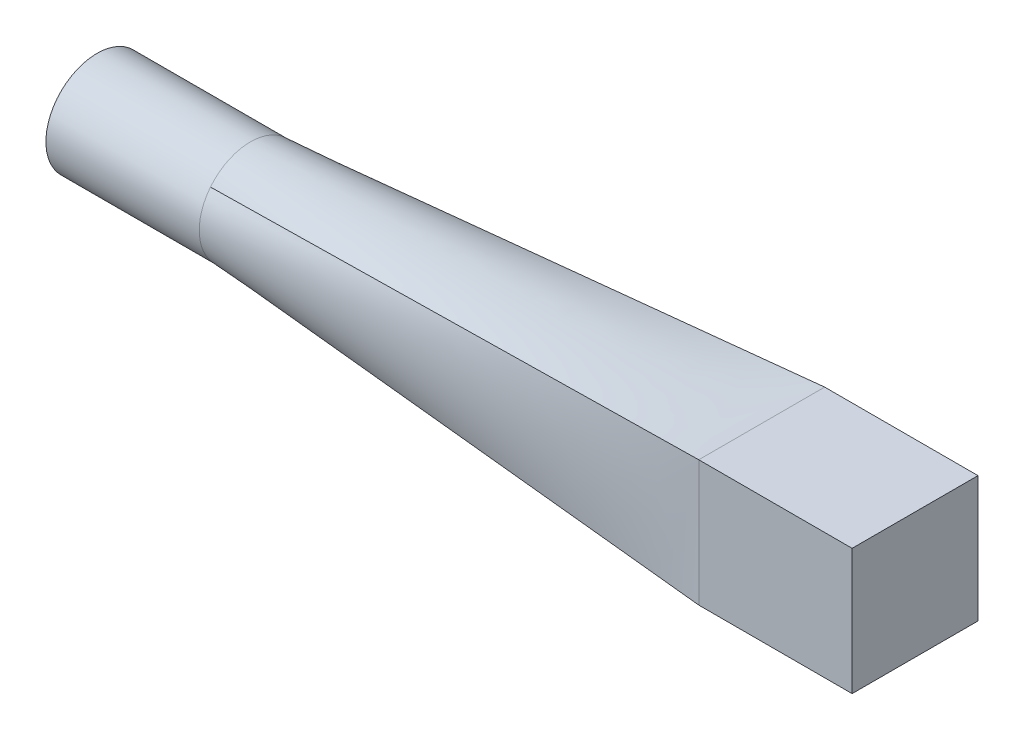
ISO-10303-21;
HEADER;
FILE_DESCRIPTION(('STEP AP214'),'2;1');
FILE_NAME('part.step','',(''),(''),'','','');
FILE_SCHEMA(('AUTOMOTIVE_DESIGN { 1 0 10303 214 1 1 1 1 }'));
ENDSEC;
DATA;
#1=APPLICATION_CONTEXT('core data for automotive mechanical design processes');
#2=APPLICATION_PROTOCOL_DEFINITION('international standard','automotive_design',2000,#1);
#3=PRODUCT_CONTEXT('',#1,'mechanical');
#4=PRODUCT('Part','Part','',(#3));
#5=PRODUCT_RELATED_PRODUCT_CATEGORY('part','',(#4));
#6=PRODUCT_DEFINITION_FORMATION('','',#4);
#7=PRODUCT_DEFINITION_CONTEXT('part definition',#1,'design');
#8=PRODUCT_DEFINITION('design','',#6,#7);
#9=PRODUCT_DEFINITION_SHAPE('','',#8);
#10=(LENGTH_UNIT() NAMED_UNIT(*) SI_UNIT(.MILLI.,.METRE.));
#11=(NAMED_UNIT(*) PLANE_ANGLE_UNIT() SI_UNIT($,.RADIAN.));
#12=(NAMED_UNIT(*) SI_UNIT($,.STERADIAN.) SOLID_ANGLE_UNIT());
#13=UNCERTAINTY_MEASURE_WITH_UNIT(LENGTH_MEASURE(1.E-05),#10,'distance_accuracy_value','');
#14=(GEOMETRIC_REPRESENTATION_CONTEXT(3) GLOBAL_UNCERTAINTY_ASSIGNED_CONTEXT((#13)) GLOBAL_UNIT_ASSIGNED_CONTEXT((#10,
#11,#12)) REPRESENTATION_CONTEXT('',''));
#15=CARTESIAN_POINT('',(0.,0.,0.));
#16=DIRECTION('',(0.,0.,1.));
#17=DIRECTION('',(1.,0.,0.));
#18=AXIS2_PLACEMENT_3D('',#15,#16,#17);
#19=CARTESIAN_POINT('',(1020.85832331262,125.73,125.73));
#20=CARTESIAN_POINT('',(680.378560960894,105.082120638562,110.397650798203));
#21=CARTESIAN_POINT('',(339.898798609163,84.4342412771248,95.0653015964059));
#22=CARTESIAN_POINT('',(-0.580963742567401,63.7863619156872,79.7329523946089));
#23=CARTESIAN_POINT('',(1020.85832331262,125.73,114.726095999935));
#24=CARTESIAN_POINT('',(680.378560960894,106.979312850249,101.543961028811));
#25=CARTESIAN_POINT('',(339.898798609163,88.2286257004976,88.3618260576862));
#26=CARTESIAN_POINT('',(-0.580963742567401,69.4779385507464,75.1796910865615));
#27=CARTESIAN_POINT('',(1020.85832331262,125.73,93.2899023629017));
#28=CARTESIAN_POINT('',(680.378560960893,110.528774380712,83.7429138017603));
#29=CARTESIAN_POINT('',(339.898798609163,95.3275487614238,74.1959252406189));
#30=CARTESIAN_POINT('',(-0.580963742567402,80.1263231421358,64.6489366794776));
#31=CARTESIAN_POINT('',(1020.85832331262,125.73,67.2687703282233));
#32=CARTESIAN_POINT('',(680.378560960894,113.985345646887,60.9769530627847));
#33=CARTESIAN_POINT('',(339.898798609163,102.240691293775,54.6851357973461));
#34=CARTESIAN_POINT('',(-0.580963742567401,90.4960369406618,48.3933185319076));
#35=CARTESIAN_POINT('',(1020.85832331262,125.73,46.6247399734059));
#36=CARTESIAN_POINT('',(680.378560960894,115.97955182152,42.4494708554893));
#37=CARTESIAN_POINT('',(339.898798609163,106.22910364304,38.2742017375726));
#38=CARTESIAN_POINT('',(-0.580963742567401,96.4786554645606,34.098932619656));
#39=CARTESIAN_POINT('',(1020.85832331262,125.73,31.1622427577089));
#40=CARTESIAN_POINT('',(680.378560960894,117.062918014343,28.4156769759035));
#41=CARTESIAN_POINT('',(339.898798609163,108.395836028686,25.6691111940981));
#42=CARTESIAN_POINT('',(-0.580963742567402,99.7287540430286,22.9225454122928));
#43=CARTESIAN_POINT('',(1020.85832331262,125.73,15.6543590063811));
#44=CARTESIAN_POINT('',(680.378560960894,117.713223533637,14.2631694539899));
#45=CARTESIAN_POINT('',(339.898798609163,109.696447067274,12.8719799015986));
#46=CARTESIAN_POINT('',(-0.580963742567401,101.679670600911,11.4807903492074));
#47=CARTESIAN_POINT('',(1020.85832331262,125.73,5.23875000000005));
#48=CARTESIAN_POINT('',(680.378560960894,117.856,4.76325586658178));
#49=CARTESIAN_POINT('',(339.898798609163,109.982,4.28776173316351));
#50=CARTESIAN_POINT('',(-0.580963742567401,102.108,3.81226759974524));
#51=CARTESIAN_POINT('',(1020.85832331262,125.73,-5.23874999999997));
#52=CARTESIAN_POINT('',(680.378560960894,117.856,-4.76325586658173));
#53=CARTESIAN_POINT('',(339.898798609163,109.982,-4.28776173316348));
#54=CARTESIAN_POINT('',(-0.580963742567401,102.108,-3.81226759974524));
#55=CARTESIAN_POINT('',(1020.85832331262,125.73,-15.654359006381));
#56=CARTESIAN_POINT('',(680.378560960894,117.713223533637,-14.2631694539898));
#57=CARTESIAN_POINT('',(339.898798609163,109.696447067274,-12.8719799015986));
#58=CARTESIAN_POINT('',(-0.5809637425674,101.679670600912,-11.4807903492074));
#59=CARTESIAN_POINT('',(1020.85832331262,125.73,-31.1622427577087));
#60=CARTESIAN_POINT('',(680.378560960894,117.062918014343,-28.4156769759034));
#61=CARTESIAN_POINT('',(339.898798609163,108.395836028686,-25.6691111940981));
#62=CARTESIAN_POINT('',(-0.580963742567403,99.7287540430285,-22.9225454122928));
#63=CARTESIAN_POINT('',(1020.85832331262,125.73,-46.6247399734059));
#64=CARTESIAN_POINT('',(680.378560960894,115.97955182152,-42.4494708554892));
#65=CARTESIAN_POINT('',(339.898798609163,106.229103643041,-38.2742017375726));
#66=CARTESIAN_POINT('',(-0.580963742567401,96.4786554645609,-34.098932619656));
#67=CARTESIAN_POINT('',(1020.85832331262,125.73,-67.2687703282233));
#68=CARTESIAN_POINT('',(680.378560960894,113.985345646887,-60.9769530627848));
#69=CARTESIAN_POINT('',(339.898798609163,102.240691293774,-54.6851357973462));
#70=CARTESIAN_POINT('',(-0.580963742567401,90.4960369406614,-48.3933185319076));
#71=CARTESIAN_POINT('',(1020.85832331262,125.73,-93.2899023629016));
#72=CARTESIAN_POINT('',(680.378560960893,110.528774380712,-83.7429138017602));
#73=CARTESIAN_POINT('',(339.898798609163,95.327548761424,-74.1959252406189));
#74=CARTESIAN_POINT('',(-0.580963742567402,80.126323142136,-64.6489366794776));
#75=CARTESIAN_POINT('',(1020.85832331262,125.73,-114.726095999935));
#76=CARTESIAN_POINT('',(680.378560960894,106.979312850249,-101.543961028811));
#77=CARTESIAN_POINT('',(339.898798609163,88.2286257004976,-88.3618260576862));
#78=CARTESIAN_POINT('',(-0.580963742567401,69.4779385507464,-75.1796910865616));
#79=CARTESIAN_POINT('',(1020.85832331262,125.73,-125.73));
#80=CARTESIAN_POINT('',(680.378560960894,105.082120638562,-110.397650798203));
#81=CARTESIAN_POINT('',(339.898798609163,84.4342412771248,-95.065301596406));
#82=CARTESIAN_POINT('',(-0.580963742567401,63.7863619156871,-79.732952394609));
#83=B_SPLINE_SURFACE_WITH_KNOTS('',3,3,((#19,#20,#21,#22),(#23,#24,#25,#26),(#27,#28,#29,#30),
(#31,#32,#33,#34),(#35,#36,#37,#38),(#39,#40,#41,#42),(#43,#44,#45,#46),(#47,#48,#49,#50),(#51,
#52,#53,#54),(#55,#56,#57,#58),(#59,#60,#61,#62),(#63,#64,#65,#66),(#67,#68,#69,#70),(#71,#72,
#73,#74),(#75,#76,#77,#78),(#79,#80,#81,#82)),.UNSPECIFIED.,.F.,.F.,.F.,(4,1,1,1,1,1,2,1,1,1,1,
1,4),(4,4),(0.732388356261361,0.765839811728691,0.799291267196021,0.816016994929686,
0.832742722663351,0.849468450397016,0.866194178130681,0.882919905864346,0.899645633598011,
0.916371361331675,0.93309708906534,0.96654854453267,1.),(0.,1.),.UNSPECIFIED.);
#84=DIRECTION('',(0.,0.,1.));
#85=VECTOR('',#84,1.);
#86=CARTESIAN_POINT('',(1020.85832331262,125.73,125.73));
#87=LINE('',#86,#85);
#88=CARTESIAN_POINT('',(1020.85832331262,125.73,-125.73));
#89=VERTEX_POINT('',#88);
#90=CARTESIAN_POINT('',(1020.85832331262,125.73,125.73));
#91=VERTEX_POINT('',#90);
#92=EDGE_CURVE('E190',#89,#91,#87,.T.);
#93=CARTESIAN_POINT('',(1020.85832331262,125.73,-125.73));
#94=CARTESIAN_POINT('',(680.378560960894,105.082120638562,-110.397650798203));
#95=CARTESIAN_POINT('',(339.898798609163,84.4342412771248,-95.065301596406));
#96=CARTESIAN_POINT('',(-0.580963742567401,63.7863619156871,-79.732952394609));
#97=B_SPLINE_CURVE_WITH_KNOTS('',3,(#93,#94,#95,#96),.UNSPECIFIED.,.F.,.F.,(4,4),(0.,1.),.UNSPECIFIED.);
#98=CARTESIAN_POINT('',(-0.580963742567449,63.7867207358641,-79.7334010755995));
#99=VERTEX_POINT('',#98);
#100=EDGE_CURVE('E176',#89,#99,#97,.T.);
#101=CARTESIAN_POINT('',(-0.580963742567401,0.,0.));
#102=DIRECTION('',(1.,0.,0.));
#103=DIRECTION('',(0.,0.,-1.));
#104=AXIS2_PLACEMENT_3D('',#101,#102,#103);
#105=CIRCLE('',#104,102.108);
#106=CARTESIAN_POINT('',(-0.580963742567449,63.7867199650153,79.7334001299435));
#107=VERTEX_POINT('',#106);
#108=EDGE_CURVE('E167',#99,#107,#105,.T.);
#109=CARTESIAN_POINT('',(1020.85832331262,125.73,125.73));
#110=CARTESIAN_POINT('',(680.378560960894,105.082120638562,110.397650798203));
#111=CARTESIAN_POINT('',(339.898798609163,84.4342412771248,95.0653015964059));
#112=CARTESIAN_POINT('',(-0.580963742567401,63.7863619156872,79.7329523946089));
#113=B_SPLINE_CURVE_WITH_KNOTS('',3,(#109,#110,#111,#112),.UNSPECIFIED.,.F.,.F.,(4,4),(0.,1.),.UNSPECIFIED.);
#114=EDGE_CURVE('E192',#91,#107,#113,.T.);
#115=ORIENTED_EDGE('',*,*,#92,.F.);
#116=ORIENTED_EDGE('',*,*,#100,.T.);
#117=ORIENTED_EDGE('',*,*,#108,.T.);
#118=ORIENTED_EDGE('',*,*,#114,.F.);
#119=EDGE_LOOP('',(#115,#116,#117,#118));
#120=FACE_BOUND('',#119,.T.);
#121=ADVANCED_FACE('F115',(#120),#83,.T.);
#122=CARTESIAN_POINT('',(1020.85832331262,-125.73,125.73));
#123=CARTESIAN_POINT('',(680.378560960894,-109.967179472376,105.60931622698));
#124=CARTESIAN_POINT('',(339.898798609163,-94.2043589447525,85.4886324539605));
#125=CARTESIAN_POINT('',(-0.580963742567401,-78.4415384171288,65.3679486809408));
#126=CARTESIAN_POINT('',(1020.85832331262,-115.2525,125.73));
#127=CARTESIAN_POINT('',(680.378560960894,-101.574227412313,107.298858699056));
#128=CARTESIAN_POINT('',(339.898798609163,-87.8959548246264,88.8677173981119));
#129=CARTESIAN_POINT('',(-0.580963742567401,-74.2176822369396,70.4365760971678));
#130=CARTESIAN_POINT('',(1020.85832331262,-94.2975,125.73));
#131=CARTESIAN_POINT('',(680.378560960894,-84.4599037847377,110.404195800578));
#132=CARTESIAN_POINT('',(339.898798609163,-74.6223075694755,95.0783916011565));
#133=CARTESIAN_POINT('',(-0.580963742567402,-64.7847113542133,79.7525874017347));
#134=CARTESIAN_POINT('',(1020.85832331262,-62.865,125.73));
#135=CARTESIAN_POINT('',(680.378560960894,-57.9792357931439,114.066220110913));
#136=CARTESIAN_POINT('',(339.898798609163,-53.0934715862879,102.402440221826));
#137=CARTESIAN_POINT('',(-0.580963742567401,-48.2077073794319,90.7386603327387));
#138=CARTESIAN_POINT('',(1020.85832331262,-31.4325,125.73));
#139=CARTESIAN_POINT('',(680.378560960894,-30.8967121321166,116.595280584255));
#140=CARTESIAN_POINT('',(339.898798609163,-30.3609242642333,107.460561168511));
#141=CARTESIAN_POINT('',(-0.5809637425674,-29.82513639635,98.325841752766));
#142=CARTESIAN_POINT('',(1020.85832331262,0.,125.73));
#143=CARTESIAN_POINT('',(680.378560960893,-3.44172585983413,117.896527394114));
#144=CARTESIAN_POINT('',(339.898798609163,-6.88345171966832,110.063054788229));
#145=CARTESIAN_POINT('',(-0.580963742567405,-10.3251775795025,102.229582182343));
#146=CARTESIAN_POINT('',(1020.85832331262,31.4325000000001,125.73));
#147=CARTESIAN_POINT('',(680.378560960894,24.1421843994743,117.921297821319));
#148=CARTESIAN_POINT('',(339.898798609163,16.8518687989486,110.112595642638));
#149=CARTESIAN_POINT('',(-0.580963742567398,9.56155319842287,102.303893463957));
#150=CARTESIAN_POINT('',(1020.85832331262,62.8650000000001,125.73));
#151=CARTESIAN_POINT('',(680.378560960894,51.60666791541,116.668573809402));
#152=CARTESIAN_POINT('',(339.898798609163,40.34833583082,107.607147618803));
#153=CARTESIAN_POINT('',(-0.580963742567403,29.09000374623,98.5457214282048));
#154=CARTESIAN_POINT('',(1020.85832331262,94.2975000000001,125.73));
#155=CARTESIAN_POINT('',(680.378560960894,78.7079982660708,114.185420164668));
#156=CARTESIAN_POINT('',(339.898798609163,63.1184965321416,102.640840329337));
#157=CARTESIAN_POINT('',(-0.580963742567401,47.5289947982123,91.096260494005));
#158=CARTESIAN_POINT('',(1020.85832331262,115.2525,125.73));
#159=CARTESIAN_POINT('',(680.378560960894,96.3797625625604,111.771537259005));
#160=CARTESIAN_POINT('',(339.898798609163,77.5070251251207,97.8130745180092));
#161=CARTESIAN_POINT('',(-0.580963742567401,58.634287687681,83.8546117770138));
#162=CARTESIAN_POINT('',(1020.85832331262,125.73,125.73));
#163=CARTESIAN_POINT('',(680.378560960894,105.082120638562,110.397650798203));
#164=CARTESIAN_POINT('',(339.898798609163,84.4342412771248,95.0653015964059));
#165=CARTESIAN_POINT('',(-0.580963742567401,63.7863619156872,79.7329523946089));
#166=B_SPLINE_SURFACE_WITH_KNOTS('',3,3,((#122,#123,#124,#125),(#126,#127,#128,#129),(#130,#131,
#132,#133),(#134,#135,#136,#137),(#138,#139,#140,#141),(#142,#143,#144,#145),(#146,#147,#148,
#149),(#150,#151,#152,#153),(#154,#155,#156,#157),(#158,#159,#160,#161),(#162,#163,#164,#165)),
.UNSPECIFIED.,.F.,.F.,.F.,(4,1,1,1,1,1,1,1,4),(4,4),(0.483979693536605,0.515030776377199,
0.546081859217794,0.577132942058388,0.608184024898983,0.639235107739578,0.670286190580172,
0.701337273420767,0.732388356261361),(0.,1.),.UNSPECIFIED.);
#167=DIRECTION('',(0.,-1.,0.));
#168=VECTOR('',#167,1.);
#169=CARTESIAN_POINT('',(1020.85832331262,-125.73,125.73));
#170=LINE('',#169,#168);
#171=CARTESIAN_POINT('',(1020.85832331262,-125.73,125.73));
#172=VERTEX_POINT('',#171);
#173=EDGE_CURVE('E271',#91,#172,#170,.T.);
#174=CARTESIAN_POINT('',(-0.580963742567449,-78.4419910130422,65.3683259191906));
#175=VERTEX_POINT('',#174);
#176=EDGE_CURVE('E13',#107,#175,#105,.T.);
#177=CARTESIAN_POINT('',(1020.85832331262,-125.73,125.73));
#178=CARTESIAN_POINT('',(680.378560960894,-109.967179472376,105.60931622698));
#179=CARTESIAN_POINT('',(339.898798609163,-94.2043589447525,85.4886324539605));
#180=CARTESIAN_POINT('',(-0.580963742567401,-78.4415384171288,65.3679486809408));
#181=B_SPLINE_CURVE_WITH_KNOTS('',3,(#177,#178,#179,#180),.UNSPECIFIED.,.F.,.F.,(4,4),(0.,1.),.UNSPECIFIED.);
#182=EDGE_CURVE('E194',#172,#175,#181,.T.);
#183=ORIENTED_EDGE('',*,*,#173,.F.);
#184=ORIENTED_EDGE('',*,*,#114,.T.);
#185=ORIENTED_EDGE('',*,*,#176,.T.);
#186=ORIENTED_EDGE('',*,*,#182,.F.);
#187=EDGE_LOOP('',(#183,#184,#185,#186));
#188=FACE_BOUND('',#187,.T.);
#189=ADVANCED_FACE('F333',(#188),#166,.T.);
#190=CARTESIAN_POINT('',(1020.85832331262,-125.73,-125.73));
#191=CARTESIAN_POINT('',(680.378560960894,-109.967179472376,-105.60931622698));
#192=CARTESIAN_POINT('',(339.898798609163,-94.2043589447526,-85.4886324539604));
#193=CARTESIAN_POINT('',(-0.580963742567401,-78.4415384171289,-65.3679486809407));
#194=CARTESIAN_POINT('',(1020.85832331262,-125.73,-115.2525));
#195=CARTESIAN_POINT('',(680.378560960894,-111.228668795551,-97.1105290391708));
#196=CARTESIAN_POINT('',(339.898798609163,-96.7273375911017,-78.9685580783415));
#197=CARTESIAN_POINT('',(-0.580963742567401,-82.2260063866526,-60.8265871175122));
#198=CARTESIAN_POINT('',(1020.85832331262,-125.73,-94.2975));
#199=CARTESIAN_POINT('',(680.378560960894,-113.488105900417,-79.8933739923743));
#200=CARTESIAN_POINT('',(339.898798609163,-101.246211800834,-65.4892479847486));
#201=CARTESIAN_POINT('',(-0.580963742567401,-89.0043177012512,-51.085121977123));
#202=CARTESIAN_POINT('',(1020.85832331262,-125.73,-62.8650000000001));
#203=CARTESIAN_POINT('',(680.378560960894,-115.984419088233,-53.5551188602736));
#204=CARTESIAN_POINT('',(339.898798609163,-106.238838176466,-44.2452377205472));
#205=CARTESIAN_POINT('',(-0.580963742567401,-96.4932572646995,-34.9353565808207));
#206=CARTESIAN_POINT('',(1020.85832331262,-125.73,-31.4325000000001));
#207=CARTESIAN_POINT('',(680.378560960894,-117.512942367677,-26.8665112801348));
#208=CARTESIAN_POINT('',(339.898798609163,-109.295884735355,-22.3005225602695));
#209=CARTESIAN_POINT('',(-0.580963742567403,-101.078827103032,-17.7345338404043));
#210=CARTESIAN_POINT('',(1020.85832331262,-125.73,0.));
#211=CARTESIAN_POINT('',(680.378560960893,-118.02759121097,0.));
#212=CARTESIAN_POINT('',(339.898798609163,-110.32518242194,0.));
#213=CARTESIAN_POINT('',(-0.580963742567399,-102.62277363291,0.));
#214=CARTESIAN_POINT('',(1020.85832331262,-125.73,31.4324999999999));
#215=CARTESIAN_POINT('',(680.378560960893,-117.512942367677,26.8665112801347));
#216=CARTESIAN_POINT('',(339.898798609163,-109.295884735355,22.3005225602696));
#217=CARTESIAN_POINT('',(-0.580963742567405,-101.078827103032,17.7345338404044));
#218=CARTESIAN_POINT('',(1020.85832331262,-125.73,62.865));
#219=CARTESIAN_POINT('',(680.378560960894,-115.984419088233,53.5551188602736));
#220=CARTESIAN_POINT('',(339.898798609163,-106.238838176466,44.2452377205473));
#221=CARTESIAN_POINT('',(-0.580963742567399,-96.4932572646995,34.9353565808209));
#222=CARTESIAN_POINT('',(1020.85832331262,-125.73,94.2975));
#223=CARTESIAN_POINT('',(680.378560960893,-113.488105900417,79.8933739923743));
#224=CARTESIAN_POINT('',(339.898798609163,-101.246211800834,65.4892479847486));
#225=CARTESIAN_POINT('',(-0.580963742567403,-89.0043177012512,51.0851219771229));
#226=CARTESIAN_POINT('',(1020.85832331262,-125.73,115.2525));
#227=CARTESIAN_POINT('',(680.378560960893,-111.228668795551,97.1105290391707));
#228=CARTESIAN_POINT('',(339.898798609163,-96.7273375911016,78.9685580783415));
#229=CARTESIAN_POINT('',(-0.580963742567401,-82.2260063866525,60.8265871175123));
#230=CARTESIAN_POINT('',(1020.85832331262,-125.73,125.73));
#231=CARTESIAN_POINT('',(680.378560960894,-109.967179472376,105.60931622698));
#232=CARTESIAN_POINT('',(339.898798609163,-94.2043589447525,85.4886324539605));
#233=CARTESIAN_POINT('',(-0.580963742567401,-78.4415384171288,65.3679486809408));
#234=B_SPLINE_SURFACE_WITH_KNOTS('',3,3,((#190,#191,#192,#193),(#194,#195,#196,#197),(#198,#199,
#200,#201),(#202,#203,#204,#205),(#206,#207,#208,#209),(#210,#211,#212,#213),(#214,#215,#216,
#217),(#218,#219,#220,#221),(#222,#223,#224,#225),(#226,#227,#228,#229),(#230,#231,#232,#233)),
.UNSPECIFIED.,.F.,.F.,.F.,(4,1,1,1,1,1,1,1,4),(4,4),(0.248408662724757,0.277855041576238,
0.307301420427719,0.3367477992792,0.366194178130681,0.395640556982162,0.425086935833643,
0.454533314685124,0.483979693536605),(0.,1.),.UNSPECIFIED.);
#235=DIRECTION('',(0.,0.,-1.));
#236=VECTOR('',#235,1.);
#237=CARTESIAN_POINT('',(1020.85832331262,-125.73,125.73));
#238=LINE('',#237,#236);
#239=CARTESIAN_POINT('',(1020.85832331262,-125.73,-125.73));
#240=VERTEX_POINT('',#239);
#241=EDGE_CURVE('E302',#172,#240,#238,.T.);
#242=CARTESIAN_POINT('',(-0.580963742567449,-78.4419888320104,-65.368324117985));
#243=VERTEX_POINT('',#242);
#244=EDGE_CURVE('E128',#175,#243,#105,.T.);
#245=CARTESIAN_POINT('',(1020.85832331262,-125.73,-125.73));
#246=CARTESIAN_POINT('',(680.378560960894,-109.967179472376,-105.60931622698));
#247=CARTESIAN_POINT('',(339.898798609163,-94.2043589447526,-85.4886324539604));
#248=CARTESIAN_POINT('',(-0.580963742567401,-78.4415384171289,-65.3679486809407));
#249=B_SPLINE_CURVE_WITH_KNOTS('',3,(#245,#246,#247,#248),.UNSPECIFIED.,.F.,.F.,(4,4),(0.,1.),.UNSPECIFIED.);
#250=EDGE_CURVE('E186',#240,#243,#249,.T.);
#251=ORIENTED_EDGE('',*,*,#241,.F.);
#252=ORIENTED_EDGE('',*,*,#182,.T.);
#253=ORIENTED_EDGE('',*,*,#244,.T.);
#254=ORIENTED_EDGE('',*,*,#250,.F.);
#255=EDGE_LOOP('',(#251,#252,#253,#254));
#256=FACE_BOUND('',#255,.T.);
#257=ADVANCED_FACE('F227',(#256),#234,.T.);
#258=CARTESIAN_POINT('',(1020.85832331262,125.73,-125.73));
#259=CARTESIAN_POINT('',(680.378560960894,105.082120638562,-110.397650798203));
#260=CARTESIAN_POINT('',(339.898798609163,84.4342412771248,-95.065301596406));
#261=CARTESIAN_POINT('',(-0.580963742567401,63.7863619156871,-79.732952394609));
#262=CARTESIAN_POINT('',(1020.85832331262,115.2525,-125.73));
#263=CARTESIAN_POINT('',(680.378560960894,96.3797625625604,-111.771537259005));
#264=CARTESIAN_POINT('',(339.898798609163,77.5070251251207,-97.8130745180093));
#265=CARTESIAN_POINT('',(-0.580963742567401,58.634287687681,-83.8546117770139));
#266=CARTESIAN_POINT('',(1020.85832331262,94.2975000000001,-125.73));
#267=CARTESIAN_POINT('',(680.378560960894,78.7079982660708,-114.185420164668));
#268=CARTESIAN_POINT('',(339.898798609163,63.1184965321415,-102.640840329337));
#269=CARTESIAN_POINT('',(-0.580963742567401,47.5289947982122,-91.0962604940049));
#270=CARTESIAN_POINT('',(1020.85832331262,62.8650000000001,-125.73));
#271=CARTESIAN_POINT('',(680.378560960894,51.6066679154101,-116.668573809402));
#272=CARTESIAN_POINT('',(339.898798609163,40.3483358308201,-107.607147618803));
#273=CARTESIAN_POINT('',(-0.580963742567403,29.0900037462301,-98.545721428205));
#274=CARTESIAN_POINT('',(1020.85832331262,31.4325000000001,-125.73));
#275=CARTESIAN_POINT('',(680.378560960894,24.1421843994743,-117.921297821319));
#276=CARTESIAN_POINT('',(339.898798609163,16.8518687989486,-110.112595642638));
#277=CARTESIAN_POINT('',(-0.5809637425674,9.56155319842282,-102.303893463957));
#278=CARTESIAN_POINT('',(1020.85832331262,0.,-125.73));
#279=CARTESIAN_POINT('',(680.378560960893,-3.44172585983413,-117.896527394114));
#280=CARTESIAN_POINT('',(339.898798609163,-6.88345171966832,-110.063054788229));
#281=CARTESIAN_POINT('',(-0.580963742567404,-10.3251775795025,-102.229582182343));
#282=CARTESIAN_POINT('',(1020.85832331262,-31.4324999999999,-125.73));
#283=CARTESIAN_POINT('',(680.378560960894,-30.8967121321167,-116.595280584255));
#284=CARTESIAN_POINT('',(339.898798609163,-30.3609242642334,-107.460561168511));
#285=CARTESIAN_POINT('',(-0.580963742567399,-29.8251363963502,-98.3258417527663));
#286=CARTESIAN_POINT('',(1020.85832331262,-62.865,-125.73));
#287=CARTESIAN_POINT('',(680.378560960894,-57.9792357931439,-114.066220110913));
#288=CARTESIAN_POINT('',(339.898798609163,-53.0934715862878,-102.402440221826));
#289=CARTESIAN_POINT('',(-0.580963742567402,-48.2077073794318,-90.7386603327383));
#290=CARTESIAN_POINT('',(1020.85832331262,-94.2975,-125.73));
#291=CARTESIAN_POINT('',(680.378560960894,-84.4599037847378,-110.404195800578));
#292=CARTESIAN_POINT('',(339.898798609163,-74.6223075694756,-95.0783916011567));
#293=CARTESIAN_POINT('',(-0.580963742567401,-64.7847113542134,-79.752587401735));
#294=CARTESIAN_POINT('',(1020.85832331262,-115.2525,-125.73));
#295=CARTESIAN_POINT('',(680.378560960894,-101.574227412313,-107.298858699056));
#296=CARTESIAN_POINT('',(339.898798609163,-87.8959548246264,-88.8677173981119));
#297=CARTESIAN_POINT('',(-0.580963742567401,-74.2176822369397,-70.4365760971677));
#298=CARTESIAN_POINT('',(1020.85832331262,-125.73,-125.73));
#299=CARTESIAN_POINT('',(680.378560960894,-109.967179472376,-105.60931622698));
#300=CARTESIAN_POINT('',(339.898798609163,-94.2043589447526,-85.4886324539604));
#301=CARTESIAN_POINT('',(-0.580963742567401,-78.4415384171289,-65.3679486809407));
#302=B_SPLINE_SURFACE_WITH_KNOTS('',3,3,((#258,#259,#260,#261),(#262,#263,#264,#265),(#266,#267,
#268,#269),(#270,#271,#272,#273),(#274,#275,#276,#277),(#278,#279,#280,#281),(#282,#283,#284,
#285),(#286,#287,#288,#289),(#290,#291,#292,#293),(#294,#295,#296,#297),(#298,#299,#300,#301)),
.UNSPECIFIED.,.F.,.F.,.F.,(4,1,1,1,1,1,1,1,4),(4,4),(0.,0.0310510828405946,0.0621021656811892,
0.0931532485217838,0.124204331362378,0.155255414202973,0.186306497043568,0.217357579884162,
0.248408662724757),(0.,1.),.UNSPECIFIED.);
#303=DIRECTION('',(0.,1.,0.));
#304=VECTOR('',#303,1.);
#305=CARTESIAN_POINT('',(1020.85832331262,-125.73,-125.73));
#306=LINE('',#305,#304);
#307=EDGE_CURVE('E209',#240,#89,#306,.T.);
#308=EDGE_CURVE('E121',#243,#99,#105,.T.);
#309=ORIENTED_EDGE('',*,*,#307,.F.);
#310=ORIENTED_EDGE('',*,*,#250,.T.);
#311=ORIENTED_EDGE('',*,*,#308,.T.);
#312=ORIENTED_EDGE('',*,*,#100,.F.);
#313=EDGE_LOOP('',(#309,#310,#311,#312));
#314=FACE_BOUND('',#313,.T.);
#315=ADVANCED_FACE('F184',(#314),#302,.T.);
#316=CARTESIAN_POINT('',(1327.18232331262,-125.73,-125.73));
#317=DIRECTION('',(0.,0.,1.));
#318=DIRECTION('',(1.,0.,0.));
#319=AXIS2_PLACEMENT_3D('',#316,#317,#318);
#320=PLANE('',#319);
#321=ORIENTED_EDGE('',*,*,#307,.T.);
#322=DIRECTION('',(-1.,0.,0.));
#323=VECTOR('',#322,1.);
#324=CARTESIAN_POINT('',(1327.18232331262,125.73,-125.73));
#325=LINE('',#324,#323);
#326=CARTESIAN_POINT('',(1327.18232331262,125.73,-125.73));
#327=VERTEX_POINT('',#326);
#328=EDGE_CURVE('E257',#327,#89,#325,.T.);
#329=ORIENTED_EDGE('',*,*,#328,.F.);
#330=DIRECTION('',(0.,1.,0.));
#331=VECTOR('',#330,1.);
#332=CARTESIAN_POINT('',(1327.18232331262,-125.73,-125.73));
#333=LINE('',#332,#331);
#334=CARTESIAN_POINT('',(1327.18232331262,-125.73,-125.73));
#335=VERTEX_POINT('',#334);
#336=EDGE_CURVE('E284',#335,#327,#333,.T.);
#337=ORIENTED_EDGE('',*,*,#336,.F.);
#338=DIRECTION('',(-1.,0.,0.));
#339=VECTOR('',#338,1.);
#340=CARTESIAN_POINT('',(1327.18232331262,-125.73,-125.73));
#341=LINE('',#340,#339);
#342=EDGE_CURVE('E266',#335,#240,#341,.T.);
#343=ORIENTED_EDGE('',*,*,#342,.T.);
#344=EDGE_LOOP('',(#321,#329,#337,#343));
#345=FACE_BOUND('',#344,.T.);
#346=ADVANCED_FACE('F226',(#345),#320,.F.);
#347=CARTESIAN_POINT('',(1327.18232331262,125.73,125.73));
#348=DIRECTION('',(0.,-1.,0.));
#349=DIRECTION('',(0.,0.,-1.));
#350=AXIS2_PLACEMENT_3D('',#347,#348,#349);
#351=PLANE('',#350);
#352=ORIENTED_EDGE('',*,*,#92,.T.);
#353=DIRECTION('',(-1.,0.,0.));
#354=VECTOR('',#353,1.);
#355=CARTESIAN_POINT('',(1327.18232331262,125.73,125.73));
#356=LINE('',#355,#354);
#357=CARTESIAN_POINT('',(1327.18232331262,125.73,125.73));
#358=VERTEX_POINT('',#357);
#359=EDGE_CURVE('E276',#358,#91,#356,.T.);
#360=ORIENTED_EDGE('',*,*,#359,.F.);
#361=DIRECTION('',(0.,0.,1.));
#362=VECTOR('',#361,1.);
#363=CARTESIAN_POINT('',(1327.18232331262,125.73,125.73));
#364=LINE('',#363,#362);
#365=EDGE_CURVE('E294',#327,#358,#364,.T.);
#366=ORIENTED_EDGE('',*,*,#365,.F.);
#367=ORIENTED_EDGE('',*,*,#328,.T.);
#368=EDGE_LOOP('',(#352,#360,#366,#367));
#369=FACE_BOUND('',#368,.T.);
#370=ADVANCED_FACE('F430',(#369),#351,.F.);
#371=CARTESIAN_POINT('',(1327.18232331262,-125.73,125.73));
#372=DIRECTION('',(0.,0.,-1.));
#373=DIRECTION('',(-1.,0.,0.));
#374=AXIS2_PLACEMENT_3D('',#371,#372,#373);
#375=PLANE('',#374);
#376=ORIENTED_EDGE('',*,*,#173,.T.);
#377=DIRECTION('',(-1.,0.,0.));
#378=VECTOR('',#377,1.);
#379=CARTESIAN_POINT('',(1327.18232331262,-125.73,125.73));
#380=LINE('',#379,#378);
#381=CARTESIAN_POINT('',(1327.18232331262,-125.73,125.73));
#382=VERTEX_POINT('',#381);
#383=EDGE_CURVE('E287',#382,#172,#380,.T.);
#384=ORIENTED_EDGE('',*,*,#383,.F.);
#385=DIRECTION('',(0.,-1.,0.));
#386=VECTOR('',#385,1.);
#387=CARTESIAN_POINT('',(1327.18232331262,-125.73,125.73));
#388=LINE('',#387,#386);
#389=EDGE_CURVE('E291',#358,#382,#388,.T.);
#390=ORIENTED_EDGE('',*,*,#389,.F.);
#391=ORIENTED_EDGE('',*,*,#359,.T.);
#392=EDGE_LOOP('',(#376,#384,#390,#391));
#393=FACE_BOUND('',#392,.T.);
#394=ADVANCED_FACE('F398',(#393),#375,.F.);
#395=CARTESIAN_POINT('',(1327.18232331262,-125.73,125.73));
#396=DIRECTION('',(0.,1.,0.));
#397=DIRECTION('',(0.,0.,1.));
#398=AXIS2_PLACEMENT_3D('',#395,#396,#397);
#399=PLANE('',#398);
#400=ORIENTED_EDGE('',*,*,#241,.T.);
#401=ORIENTED_EDGE('',*,*,#342,.F.);
#402=DIRECTION('',(0.,0.,-1.));
#403=VECTOR('',#402,1.);
#404=CARTESIAN_POINT('',(1327.18232331262,-125.73,125.73));
#405=LINE('',#404,#403);
#406=EDGE_CURVE('E288',#382,#335,#405,.T.);
#407=ORIENTED_EDGE('',*,*,#406,.F.);
#408=ORIENTED_EDGE('',*,*,#383,.T.);
#409=EDGE_LOOP('',(#400,#401,#407,#408));
#410=FACE_BOUND('',#409,.T.);
#411=ADVANCED_FACE('F394',(#410),#399,.F.);
#412=CARTESIAN_POINT('',(1327.18232331262,0.,0.));
#413=DIRECTION('',(-1.,0.,0.));
#414=DIRECTION('',(0.,0.,1.));
#415=AXIS2_PLACEMENT_3D('',#412,#413,#414);
#416=PLANE('',#415);
#417=ORIENTED_EDGE('',*,*,#336,.T.);
#418=ORIENTED_EDGE('',*,*,#365,.T.);
#419=ORIENTED_EDGE('',*,*,#389,.T.);
#420=ORIENTED_EDGE('',*,*,#406,.T.);
#421=EDGE_LOOP('',(#417,#418,#419,#420));
#422=FACE_BOUND('',#421,.T.);
#423=ADVANCED_FACE('F390',(#422),#416,.F.);
#424=CARTESIAN_POINT('',(-306.904963742567,0.,0.));
#425=DIRECTION('',(1.,0.,0.));
#426=DIRECTION('',(0.,0.,-1.));
#427=AXIS2_PLACEMENT_3D('',#424,#425,#426);
#428=CYLINDRICAL_SURFACE('',#427,102.108);
#429=CARTESIAN_POINT('',(-306.904963742567,0.,0.));
#430=DIRECTION('',(1.,0.,0.));
#431=DIRECTION('',(0.,0.,-1.));
#432=AXIS2_PLACEMENT_3D('',#429,#430,#431);
#433=CIRCLE('',#432,102.108);
#434=CARTESIAN_POINT('',(-306.904963742567,0.,-102.108));
#435=VERTEX_POINT('',#434);
#436=EDGE_CURVE('E432',#435,#435,#433,.T.);
#437=ORIENTED_EDGE('',*,*,#436,.T.);
#438=EDGE_LOOP('',(#437));
#439=FACE_BOUND('',#438,.T.);
#440=ORIENTED_EDGE('',*,*,#108,.F.);
#441=ORIENTED_EDGE('',*,*,#308,.F.);
#442=ORIENTED_EDGE('',*,*,#244,.F.);
#443=ORIENTED_EDGE('',*,*,#176,.F.);
#444=EDGE_LOOP('',(#440,#441,#442,#443));
#445=FACE_BOUND('',#444,.T.);
#446=ADVANCED_FACE('F169',(#439,#445),#428,.T.);
#447=CARTESIAN_POINT('',(-306.904963742567,0.,0.));
#448=DIRECTION('',(1.,0.,0.));
#449=DIRECTION('',(0.,0.,-1.));
#450=AXIS2_PLACEMENT_3D('',#447,#448,#449);
#451=PLANE('',#450);
#452=ORIENTED_EDGE('',*,*,#436,.F.);
#453=EDGE_LOOP('',(#452));
#454=FACE_BOUND('',#453,.T.);
#455=ADVANCED_FACE('F389',(#454),#451,.F.);
#456=CLOSED_SHELL('',(#121,#189,#257,#315,#346,#370,#394,#411,#423,#446,#455));
#457=MANIFOLD_SOLID_BREP('B2',#456);
#458=ADVANCED_BREP_SHAPE_REPRESENTATION('',(#18,#457),#14);
#459=SHAPE_DEFINITION_REPRESENTATION(#9,#458);
ENDSEC;
END-ISO-10303-21;
